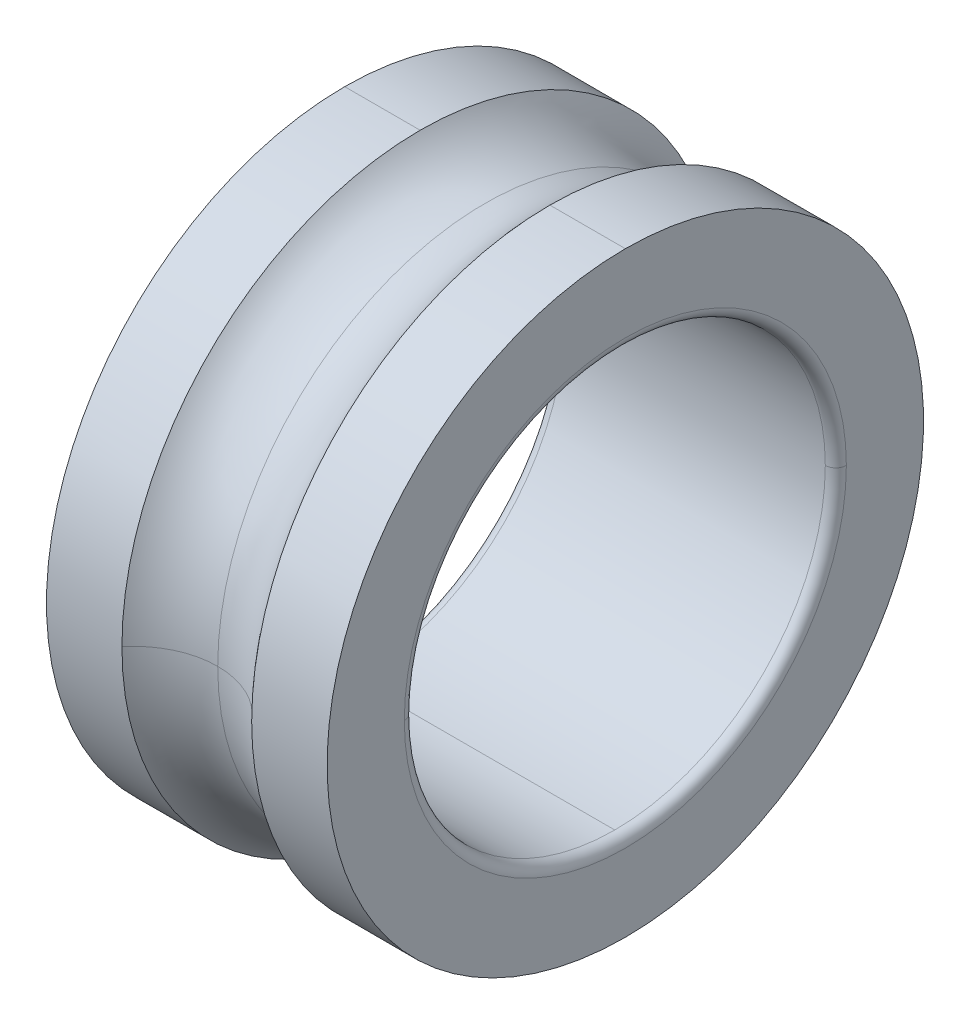
ISO-10303-21;
HEADER;
FILE_DESCRIPTION(('STEP AP214'),'2;1');
FILE_NAME('part.step','',(''),(''),'','','');
FILE_SCHEMA(('AUTOMOTIVE_DESIGN { 1 0 10303 214 1 1 1 1 }'));
ENDSEC;
DATA;
#1=APPLICATION_CONTEXT('core data for automotive mechanical design processes');
#2=APPLICATION_PROTOCOL_DEFINITION('international standard','automotive_design',2000,#1);
#3=PRODUCT_CONTEXT('',#1,'mechanical');
#4=PRODUCT('Part','Part','',(#3));
#5=PRODUCT_RELATED_PRODUCT_CATEGORY('part','',(#4));
#6=PRODUCT_DEFINITION_FORMATION('','',#4);
#7=PRODUCT_DEFINITION_CONTEXT('part definition',#1,'design');
#8=PRODUCT_DEFINITION('design','',#6,#7);
#9=PRODUCT_DEFINITION_SHAPE('','',#8);
#10=(LENGTH_UNIT() NAMED_UNIT(*) SI_UNIT(.MILLI.,.METRE.));
#11=(NAMED_UNIT(*) PLANE_ANGLE_UNIT() SI_UNIT($,.RADIAN.));
#12=(NAMED_UNIT(*) SI_UNIT($,.STERADIAN.) SOLID_ANGLE_UNIT());
#13=UNCERTAINTY_MEASURE_WITH_UNIT(LENGTH_MEASURE(1.E-05),#10,'distance_accuracy_value','');
#14=(GEOMETRIC_REPRESENTATION_CONTEXT(3) GLOBAL_UNCERTAINTY_ASSIGNED_CONTEXT((#13)) GLOBAL_UNIT_ASSIGNED_CONTEXT((#10,
#11,#12)) REPRESENTATION_CONTEXT('',''));
#15=CARTESIAN_POINT('',(0.,0.,0.));
#16=DIRECTION('',(0.,0.,1.));
#17=DIRECTION('',(1.,0.,0.));
#18=AXIS2_PLACEMENT_3D('',#15,#16,#17);
#19=CARTESIAN_POINT('',(6.92454867367814,0.,0.));
#20=DIRECTION('',(1.,0.,0.));
#21=DIRECTION('',(0.,1.,0.));
#22=AXIS2_PLACEMENT_3D('',#19,#20,#21);
#23=CYLINDRICAL_SURFACE('',#22,8.5);
#24=DIRECTION('',(1.,0.,0.));
#25=VECTOR('',#24,1.);
#26=CARTESIAN_POINT('',(6.92454867367814,8.5,0.));
#27=LINE('',#26,#25);
#28=CARTESIAN_POINT('',(5.84909734735627,8.5,0.));
#29=VERTEX_POINT('',#28);
#30=CARTESIAN_POINT('',(8.,8.5,0.));
#31=VERTEX_POINT('',#30);
#32=EDGE_CURVE('E148',#29,#31,#27,.T.);
#33=ORIENTED_EDGE('',*,*,#32,.T.);
#34=CARTESIAN_POINT('',(8.,0.,0.));
#35=DIRECTION('',(1.,0.,0.));
#36=DIRECTION('',(0.,1.,0.));
#37=AXIS2_PLACEMENT_3D('',#34,#35,#36);
#38=CIRCLE('',#37,8.5);
#39=CARTESIAN_POINT('',(8.,-8.5,0.));
#40=VERTEX_POINT('',#39);
#41=EDGE_CURVE('E210',#40,#31,#38,.T.);
#42=ORIENTED_EDGE('',*,*,#41,.F.);
#43=DIRECTION('',(-1.,0.,0.));
#44=VECTOR('',#43,1.);
#45=CARTESIAN_POINT('',(6.92454867367814,-8.5,0.));
#46=LINE('',#45,#44);
#47=CARTESIAN_POINT('',(5.84909734735627,-8.5,0.));
#48=VERTEX_POINT('',#47);
#49=EDGE_CURVE('E154',#40,#48,#46,.T.);
#50=ORIENTED_EDGE('',*,*,#49,.T.);
#51=CARTESIAN_POINT('',(5.84909734735627,0.,0.));
#52=DIRECTION('',(1.,0.,0.));
#53=DIRECTION('',(0.,1.,0.));
#54=AXIS2_PLACEMENT_3D('',#51,#52,#53);
#55=CIRCLE('',#54,8.5);
#56=CARTESIAN_POINT('',(5.84909734735627,0.,-8.5));
#57=VERTEX_POINT('',#56);
#58=EDGE_CURVE('E139',#48,#57,#55,.T.);
#59=ORIENTED_EDGE('',*,*,#58,.T.);
#60=CARTESIAN_POINT('',(5.84909734735627,0.,0.));
#61=DIRECTION('',(1.,0.,0.));
#62=DIRECTION('',(0.,1.,0.));
#63=AXIS2_PLACEMENT_3D('',#60,#61,#62);
#64=CIRCLE('',#63,8.5);
#65=EDGE_CURVE('E145',#57,#29,#64,.T.);
#66=ORIENTED_EDGE('',*,*,#65,.T.);
#67=EDGE_LOOP('',(#33,#42,#50,#59,#66));
#68=FACE_BOUND('',#67,.T.);
#69=ADVANCED_FACE('F16',(#68),#23,.T.);
#70=CARTESIAN_POINT('',(4.,0.,0.));
#71=DIRECTION('',(1.,0.,0.));
#72=DIRECTION('',(0.,0.,-1.));
#73=AXIS2_PLACEMENT_3D('',#70,#71,#72);
#74=TOROIDAL_SURFACE('',#73,10.,2.381);
#75=CARTESIAN_POINT('',(4.,0.,0.));
#76=DIRECTION('',(-1.,0.,0.));
#77=DIRECTION('',(0.,0.,1.));
#78=AXIS2_PLACEMENT_3D('',#75,#76,#77);
#79=CIRCLE('',#78,7.619);
#80=CARTESIAN_POINT('',(4.,0.,7.619));
#81=VERTEX_POINT('',#80);
#82=CARTESIAN_POINT('',(4.,0.,-7.619));
#83=VERTEX_POINT('',#82);
#84=EDGE_CURVE('E132',#81,#83,#79,.T.);
#85=ORIENTED_EDGE('',*,*,#84,.T.);
#86=CARTESIAN_POINT('',(4.,0.,-10.));
#87=DIRECTION('',(0.,-1.,0.));
#88=DIRECTION('',(0.,0.,-1.));
#89=AXIS2_PLACEMENT_3D('',#86,#87,#88);
#90=CIRCLE('',#89,2.381);
#91=CARTESIAN_POINT('',(2.15090265264373,0.,-8.5));
#92=VERTEX_POINT('',#91);
#93=EDGE_CURVE('E126',#83,#92,#90,.T.);
#94=ORIENTED_EDGE('',*,*,#93,.T.);
#95=CARTESIAN_POINT('',(2.15090265264373,0.,0.));
#96=DIRECTION('',(1.,0.,0.));
#97=DIRECTION('',(0.,1.,0.));
#98=AXIS2_PLACEMENT_3D('',#95,#96,#97);
#99=CIRCLE('',#98,8.5);
#100=CARTESIAN_POINT('',(2.15090265264373,8.5,0.));
#101=VERTEX_POINT('',#100);
#102=EDGE_CURVE('E11',#92,#101,#99,.T.);
#103=ORIENTED_EDGE('',*,*,#102,.T.);
#104=CARTESIAN_POINT('',(2.15090265264373,0.,0.));
#105=DIRECTION('',(1.,0.,0.));
#106=DIRECTION('',(0.,1.,0.));
#107=AXIS2_PLACEMENT_3D('',#104,#105,#106);
#108=CIRCLE('',#107,8.5);
#109=CARTESIAN_POINT('',(2.15090265264373,0.,8.5));
#110=VERTEX_POINT('',#109);
#111=EDGE_CURVE('E125',#101,#110,#108,.T.);
#112=ORIENTED_EDGE('',*,*,#111,.T.);
#113=CARTESIAN_POINT('',(4.,0.,10.));
#114=DIRECTION('',(0.,-1.,0.));
#115=DIRECTION('',(0.,0.,1.));
#116=AXIS2_PLACEMENT_3D('',#113,#114,#115);
#117=CIRCLE('',#116,2.381);
#118=EDGE_CURVE('E163',#110,#81,#117,.T.);
#119=ORIENTED_EDGE('',*,*,#118,.T.);
#120=EDGE_LOOP('',(#85,#94,#103,#112,#119));
#121=FACE_BOUND('',#120,.T.);
#122=ADVANCED_FACE('F259',(#121),#74,.F.);
#123=CARTESIAN_POINT('',(1.07545132632186,0.,0.));
#124=DIRECTION('',(1.,0.,0.));
#125=DIRECTION('',(0.,1.,0.));
#126=AXIS2_PLACEMENT_3D('',#123,#124,#125);
#127=CYLINDRICAL_SURFACE('',#126,8.5);
#128=DIRECTION('',(1.,0.,0.));
#129=VECTOR('',#128,1.);
#130=CARTESIAN_POINT('',(1.07545132632186,8.5,0.));
#131=LINE('',#130,#129);
#132=CARTESIAN_POINT('',(0.,8.5,0.));
#133=VERTEX_POINT('',#132);
#134=EDGE_CURVE('E112',#133,#101,#131,.T.);
#135=ORIENTED_EDGE('',*,*,#134,.T.);
#136=ORIENTED_EDGE('',*,*,#102,.F.);
#137=CARTESIAN_POINT('',(2.15090265264373,0.,0.));
#138=DIRECTION('',(1.,0.,0.));
#139=DIRECTION('',(0.,1.,0.));
#140=AXIS2_PLACEMENT_3D('',#137,#138,#139);
#141=CIRCLE('',#140,8.5);
#142=CARTESIAN_POINT('',(2.15090265264373,-8.5,0.));
#143=VERTEX_POINT('',#142);
#144=EDGE_CURVE('E129',#143,#92,#141,.T.);
#145=ORIENTED_EDGE('',*,*,#144,.F.);
#146=DIRECTION('',(-1.,0.,0.));
#147=VECTOR('',#146,1.);
#148=CARTESIAN_POINT('',(1.07545132632186,-8.5,0.));
#149=LINE('',#148,#147);
#150=CARTESIAN_POINT('',(0.,-8.5,0.));
#151=VERTEX_POINT('',#150);
#152=EDGE_CURVE('E114',#143,#151,#149,.T.);
#153=ORIENTED_EDGE('',*,*,#152,.T.);
#154=CARTESIAN_POINT('',(0.,0.,0.));
#155=DIRECTION('',(1.,0.,0.));
#156=DIRECTION('',(0.,1.,0.));
#157=AXIS2_PLACEMENT_3D('',#154,#155,#156);
#158=CIRCLE('',#157,8.5);
#159=EDGE_CURVE('E23',#151,#133,#158,.T.);
#160=ORIENTED_EDGE('',*,*,#159,.T.);
#161=EDGE_LOOP('',(#135,#136,#145,#153,#160));
#162=FACE_BOUND('',#161,.T.);
#163=ADVANCED_FACE('F110',(#162),#127,.T.);
#164=CARTESIAN_POINT('',(0.,7.4,0.));
#165=DIRECTION('',(-1.,0.,0.));
#166=DIRECTION('',(0.,0.,1.));
#167=AXIS2_PLACEMENT_3D('',#164,#165,#166);
#168=PLANE('',#167);
#169=CARTESIAN_POINT('',(0.,0.,0.));
#170=DIRECTION('',(1.,0.,0.));
#171=DIRECTION('',(0.,1.,0.));
#172=AXIS2_PLACEMENT_3D('',#169,#170,#171);
#173=CIRCLE('',#172,6.3);
#174=CARTESIAN_POINT('',(0.,0.,6.3));
#175=VERTEX_POINT('',#174);
#176=CARTESIAN_POINT('',(0.,0.,-6.3));
#177=VERTEX_POINT('',#176);
#178=EDGE_CURVE('E117',#175,#177,#173,.T.);
#179=ORIENTED_EDGE('',*,*,#178,.T.);
#180=CARTESIAN_POINT('',(0.,0.,0.));
#181=DIRECTION('',(1.,0.,0.));
#182=DIRECTION('',(0.,1.,0.));
#183=AXIS2_PLACEMENT_3D('',#180,#181,#182);
#184=CIRCLE('',#183,6.3);
#185=EDGE_CURVE('E184',#177,#175,#184,.T.);
#186=ORIENTED_EDGE('',*,*,#185,.T.);
#187=EDGE_LOOP('',(#179,#186));
#188=FACE_BOUND('',#187,.T.);
#189=CARTESIAN_POINT('',(0.,0.,0.));
#190=DIRECTION('',(1.,0.,0.));
#191=DIRECTION('',(0.,1.,0.));
#192=AXIS2_PLACEMENT_3D('',#189,#190,#191);
#193=CIRCLE('',#192,8.5);
#194=EDGE_CURVE('E118',#133,#151,#193,.T.);
#195=ORIENTED_EDGE('',*,*,#194,.F.);
#196=ORIENTED_EDGE('',*,*,#159,.F.);
#197=EDGE_LOOP('',(#195,#196));
#198=FACE_BOUND('',#197,.T.);
#199=ADVANCED_FACE('F119',(#188,#198),#168,.T.);
#200=CARTESIAN_POINT('',(0.3,0.,0.));
#201=DIRECTION('',(1.,0.,0.));
#202=DIRECTION('',(0.,0.,-1.));
#203=AXIS2_PLACEMENT_3D('',#200,#201,#202);
#204=TOROIDAL_SURFACE('',#203,6.3,0.3);
#205=CARTESIAN_POINT('',(0.3,0.,-6.3));
#206=DIRECTION('',(0.,-1.,0.));
#207=DIRECTION('',(0.,0.,-1.));
#208=AXIS2_PLACEMENT_3D('',#205,#206,#207);
#209=CIRCLE('',#208,0.3);
#210=CARTESIAN_POINT('',(0.3,0.,-6.));
#211=VERTEX_POINT('',#210);
#212=EDGE_CURVE('E172',#211,#177,#209,.T.);
#213=ORIENTED_EDGE('',*,*,#212,.T.);
#214=ORIENTED_EDGE('',*,*,#178,.F.);
#215=CARTESIAN_POINT('',(0.3,0.,6.3));
#216=DIRECTION('',(0.,-1.,0.));
#217=DIRECTION('',(0.,0.,1.));
#218=AXIS2_PLACEMENT_3D('',#215,#216,#217);
#219=CIRCLE('',#218,0.3);
#220=CARTESIAN_POINT('',(0.3,0.,6.));
#221=VERTEX_POINT('',#220);
#222=EDGE_CURVE('E181',#175,#221,#219,.T.);
#223=ORIENTED_EDGE('',*,*,#222,.T.);
#224=CARTESIAN_POINT('',(0.3,0.,0.));
#225=DIRECTION('',(1.,0.,0.));
#226=DIRECTION('',(0.,1.,0.));
#227=AXIS2_PLACEMENT_3D('',#224,#225,#226);
#228=CIRCLE('',#227,6.);
#229=CARTESIAN_POINT('',(0.3,-6.,0.));
#230=VERTEX_POINT('',#229);
#231=EDGE_CURVE('E214',#221,#230,#228,.T.);
#232=ORIENTED_EDGE('',*,*,#231,.T.);
#233=CARTESIAN_POINT('',(0.3,0.,0.));
#234=DIRECTION('',(1.,0.,0.));
#235=DIRECTION('',(0.,1.,0.));
#236=AXIS2_PLACEMENT_3D('',#233,#234,#235);
#237=CIRCLE('',#236,6.);
#238=EDGE_CURVE('E190',#230,#211,#237,.T.);
#239=ORIENTED_EDGE('',*,*,#238,.T.);
#240=EDGE_LOOP('',(#213,#214,#223,#232,#239));
#241=FACE_BOUND('',#240,.T.);
#242=ADVANCED_FACE('F223',(#241),#204,.T.);
#243=CARTESIAN_POINT('',(4.,0.,0.));
#244=DIRECTION('',(1.,0.,0.));
#245=DIRECTION('',(0.,1.,0.));
#246=AXIS2_PLACEMENT_3D('',#243,#244,#245);
#247=CYLINDRICAL_SURFACE('',#246,6.);
#248=DIRECTION('',(1.,0.,0.));
#249=VECTOR('',#248,1.);
#250=CARTESIAN_POINT('',(4.,6.,0.));
#251=LINE('',#250,#249);
#252=CARTESIAN_POINT('',(0.3,6.,0.));
#253=VERTEX_POINT('',#252);
#254=CARTESIAN_POINT('',(7.7,6.,0.));
#255=VERTEX_POINT('',#254);
#256=EDGE_CURVE('E187',#253,#255,#251,.T.);
#257=ORIENTED_EDGE('',*,*,#256,.T.);
#258=CARTESIAN_POINT('',(7.7,0.,0.));
#259=DIRECTION('',(1.,0.,0.));
#260=DIRECTION('',(0.,1.,0.));
#261=AXIS2_PLACEMENT_3D('',#258,#259,#260);
#262=CIRCLE('',#261,6.);
#263=CARTESIAN_POINT('',(7.7,0.,6.));
#264=VERTEX_POINT('',#263);
#265=EDGE_CURVE('E208',#255,#264,#262,.T.);
#266=ORIENTED_EDGE('',*,*,#265,.T.);
#267=CARTESIAN_POINT('',(7.7,0.,0.));
#268=DIRECTION('',(1.,0.,0.));
#269=DIRECTION('',(0.,1.,0.));
#270=AXIS2_PLACEMENT_3D('',#267,#268,#269);
#271=CIRCLE('',#270,6.);
#272=CARTESIAN_POINT('',(7.7,-6.,0.));
#273=VERTEX_POINT('',#272);
#274=EDGE_CURVE('E30',#264,#273,#271,.T.);
#275=ORIENTED_EDGE('',*,*,#274,.T.);
#276=DIRECTION('',(-1.,0.,0.));
#277=VECTOR('',#276,1.);
#278=CARTESIAN_POINT('',(4.,-6.,0.));
#279=LINE('',#278,#277);
#280=EDGE_CURVE('E192',#273,#230,#279,.T.);
#281=ORIENTED_EDGE('',*,*,#280,.T.);
#282=ORIENTED_EDGE('',*,*,#231,.F.);
#283=CARTESIAN_POINT('',(0.3,0.,0.));
#284=DIRECTION('',(1.,0.,0.));
#285=DIRECTION('',(0.,1.,0.));
#286=AXIS2_PLACEMENT_3D('',#283,#284,#285);
#287=CIRCLE('',#286,6.);
#288=EDGE_CURVE('E178',#253,#221,#287,.T.);
#289=ORIENTED_EDGE('',*,*,#288,.F.);
#290=EDGE_LOOP('',(#257,#266,#275,#281,#282,#289));
#291=FACE_BOUND('',#290,.T.);
#292=ADVANCED_FACE('F231',(#291),#247,.F.);
#293=CARTESIAN_POINT('',(7.7,0.,0.));
#294=DIRECTION('',(1.,0.,0.));
#295=DIRECTION('',(0.,0.,-1.));
#296=AXIS2_PLACEMENT_3D('',#293,#294,#295);
#297=TOROIDAL_SURFACE('',#296,6.3,0.3);
#298=CARTESIAN_POINT('',(7.7,0.,-6.3));
#299=DIRECTION('',(0.,-1.,0.));
#300=DIRECTION('',(0.,0.,-1.));
#301=AXIS2_PLACEMENT_3D('',#298,#299,#300);
#302=CIRCLE('',#301,0.3);
#303=CARTESIAN_POINT('',(8.,0.,-6.3));
#304=VERTEX_POINT('',#303);
#305=CARTESIAN_POINT('',(7.7,0.,-6.));
#306=VERTEX_POINT('',#305);
#307=EDGE_CURVE('E201',#304,#306,#302,.T.);
#308=ORIENTED_EDGE('',*,*,#307,.T.);
#309=CARTESIAN_POINT('',(7.7,0.,0.));
#310=DIRECTION('',(1.,0.,0.));
#311=DIRECTION('',(0.,1.,0.));
#312=AXIS2_PLACEMENT_3D('',#309,#310,#311);
#313=CIRCLE('',#312,6.);
#314=EDGE_CURVE('E195',#273,#306,#313,.T.);
#315=ORIENTED_EDGE('',*,*,#314,.F.);
#316=ORIENTED_EDGE('',*,*,#274,.F.);
#317=CARTESIAN_POINT('',(7.7,0.,6.3));
#318=DIRECTION('',(0.,-1.,0.));
#319=DIRECTION('',(0.,0.,1.));
#320=AXIS2_PLACEMENT_3D('',#317,#318,#319);
#321=CIRCLE('',#320,0.3);
#322=CARTESIAN_POINT('',(8.,0.,6.3));
#323=VERTEX_POINT('',#322);
#324=EDGE_CURVE('E206',#264,#323,#321,.T.);
#325=ORIENTED_EDGE('',*,*,#324,.T.);
#326=CARTESIAN_POINT('',(8.,0.,0.));
#327=DIRECTION('',(1.,0.,0.));
#328=DIRECTION('',(0.,1.,0.));
#329=AXIS2_PLACEMENT_3D('',#326,#327,#328);
#330=CIRCLE('',#329,6.3);
#331=EDGE_CURVE('E37',#323,#304,#330,.T.);
#332=ORIENTED_EDGE('',*,*,#331,.T.);
#333=EDGE_LOOP('',(#308,#315,#316,#325,#332));
#334=FACE_BOUND('',#333,.T.);
#335=ADVANCED_FACE('F233',(#334),#297,.T.);
#336=CARTESIAN_POINT('',(8.,7.4,0.));
#337=DIRECTION('',(1.,0.,0.));
#338=DIRECTION('',(0.,1.,0.));
#339=AXIS2_PLACEMENT_3D('',#336,#337,#338);
#340=PLANE('',#339);
#341=CARTESIAN_POINT('',(8.,0.,0.));
#342=DIRECTION('',(1.,0.,0.));
#343=DIRECTION('',(0.,1.,0.));
#344=AXIS2_PLACEMENT_3D('',#341,#342,#343);
#345=CIRCLE('',#344,6.3);
#346=EDGE_CURVE('E203',#304,#323,#345,.T.);
#347=ORIENTED_EDGE('',*,*,#346,.F.);
#348=ORIENTED_EDGE('',*,*,#331,.F.);
#349=EDGE_LOOP('',(#347,#348));
#350=FACE_BOUND('',#349,.T.);
#351=CARTESIAN_POINT('',(8.,0.,0.));
#352=DIRECTION('',(1.,0.,0.));
#353=DIRECTION('',(0.,1.,0.));
#354=AXIS2_PLACEMENT_3D('',#351,#352,#353);
#355=CIRCLE('',#354,8.5);
#356=EDGE_CURVE('E156',#31,#40,#355,.T.);
#357=ORIENTED_EDGE('',*,*,#356,.T.);
#358=ORIENTED_EDGE('',*,*,#41,.T.);
#359=EDGE_LOOP('',(#357,#358));
#360=FACE_BOUND('',#359,.T.);
#361=ADVANCED_FACE('F238',(#350,#360),#340,.T.);
#362=CARTESIAN_POINT('',(7.7,0.,0.));
#363=DIRECTION('',(1.,0.,0.));
#364=DIRECTION('',(0.,0.,-1.));
#365=AXIS2_PLACEMENT_3D('',#362,#363,#364);
#366=TOROIDAL_SURFACE('',#365,6.3,0.3);
#367=ORIENTED_EDGE('',*,*,#307,.F.);
#368=ORIENTED_EDGE('',*,*,#346,.T.);
#369=ORIENTED_EDGE('',*,*,#324,.F.);
#370=ORIENTED_EDGE('',*,*,#265,.F.);
#371=CARTESIAN_POINT('',(7.7,0.,0.));
#372=DIRECTION('',(1.,0.,0.));
#373=DIRECTION('',(0.,1.,0.));
#374=AXIS2_PLACEMENT_3D('',#371,#372,#373);
#375=CIRCLE('',#374,6.);
#376=EDGE_CURVE('E198',#306,#255,#375,.T.);
#377=ORIENTED_EDGE('',*,*,#376,.F.);
#378=EDGE_LOOP('',(#367,#368,#369,#370,#377));
#379=FACE_BOUND('',#378,.T.);
#380=ADVANCED_FACE('F236',(#379),#366,.T.);
#381=CARTESIAN_POINT('',(4.,0.,0.));
#382=DIRECTION('',(1.,0.,0.));
#383=DIRECTION('',(0.,1.,0.));
#384=AXIS2_PLACEMENT_3D('',#381,#382,#383);
#385=CYLINDRICAL_SURFACE('',#384,6.);
#386=ORIENTED_EDGE('',*,*,#256,.F.);
#387=CARTESIAN_POINT('',(0.3,0.,0.));
#388=DIRECTION('',(1.,0.,0.));
#389=DIRECTION('',(0.,1.,0.));
#390=AXIS2_PLACEMENT_3D('',#387,#388,#389);
#391=CIRCLE('',#390,6.);
#392=EDGE_CURVE('E175',#211,#253,#391,.T.);
#393=ORIENTED_EDGE('',*,*,#392,.F.);
#394=ORIENTED_EDGE('',*,*,#238,.F.);
#395=ORIENTED_EDGE('',*,*,#280,.F.);
#396=ORIENTED_EDGE('',*,*,#314,.T.);
#397=ORIENTED_EDGE('',*,*,#376,.T.);
#398=EDGE_LOOP('',(#386,#393,#394,#395,#396,#397));
#399=FACE_BOUND('',#398,.T.);
#400=ADVANCED_FACE('F228',(#399),#385,.F.);
#401=CARTESIAN_POINT('',(0.3,0.,0.));
#402=DIRECTION('',(1.,0.,0.));
#403=DIRECTION('',(0.,0.,-1.));
#404=AXIS2_PLACEMENT_3D('',#401,#402,#403);
#405=TOROIDAL_SURFACE('',#404,6.3,0.3);
#406=ORIENTED_EDGE('',*,*,#212,.F.);
#407=ORIENTED_EDGE('',*,*,#392,.T.);
#408=ORIENTED_EDGE('',*,*,#288,.T.);
#409=ORIENTED_EDGE('',*,*,#222,.F.);
#410=ORIENTED_EDGE('',*,*,#185,.F.);
#411=EDGE_LOOP('',(#406,#407,#408,#409,#410));
#412=FACE_BOUND('',#411,.T.);
#413=ADVANCED_FACE('F222',(#412),#405,.T.);
#414=CARTESIAN_POINT('',(1.07545132632186,0.,0.));
#415=DIRECTION('',(1.,0.,0.));
#416=DIRECTION('',(0.,1.,0.));
#417=AXIS2_PLACEMENT_3D('',#414,#415,#416);
#418=CYLINDRICAL_SURFACE('',#417,8.5);
#419=ORIENTED_EDGE('',*,*,#134,.F.);
#420=ORIENTED_EDGE('',*,*,#194,.T.);
#421=ORIENTED_EDGE('',*,*,#152,.F.);
#422=CARTESIAN_POINT('',(2.15090265264373,0.,0.));
#423=DIRECTION('',(1.,0.,0.));
#424=DIRECTION('',(0.,1.,0.));
#425=AXIS2_PLACEMENT_3D('',#422,#423,#424);
#426=CIRCLE('',#425,8.5);
#427=EDGE_CURVE('E165',#110,#143,#426,.T.);
#428=ORIENTED_EDGE('',*,*,#427,.F.);
#429=ORIENTED_EDGE('',*,*,#111,.F.);
#430=EDGE_LOOP('',(#419,#420,#421,#428,#429));
#431=FACE_BOUND('',#430,.T.);
#432=ADVANCED_FACE('F123',(#431),#418,.T.);
#433=CARTESIAN_POINT('',(4.,0.,0.));
#434=DIRECTION('',(1.,0.,0.));
#435=DIRECTION('',(0.,0.,-1.));
#436=AXIS2_PLACEMENT_3D('',#433,#434,#435);
#437=TOROIDAL_SURFACE('',#436,10.,2.381);
#438=CARTESIAN_POINT('',(4.,0.,0.));
#439=DIRECTION('',(-1.,0.,0.));
#440=DIRECTION('',(0.,0.,1.));
#441=AXIS2_PLACEMENT_3D('',#438,#439,#440);
#442=CIRCLE('',#441,7.619);
#443=EDGE_CURVE('E142',#83,#81,#442,.T.);
#444=ORIENTED_EDGE('',*,*,#443,.T.);
#445=ORIENTED_EDGE('',*,*,#118,.F.);
#446=ORIENTED_EDGE('',*,*,#427,.T.);
#447=ORIENTED_EDGE('',*,*,#144,.T.);
#448=ORIENTED_EDGE('',*,*,#93,.F.);
#449=EDGE_LOOP('',(#444,#445,#446,#447,#448));
#450=FACE_BOUND('',#449,.T.);
#451=ADVANCED_FACE('F262',(#450),#437,.F.);
#452=CARTESIAN_POINT('',(6.92454867367814,0.,0.));
#453=DIRECTION('',(1.,0.,0.));
#454=DIRECTION('',(0.,1.,0.));
#455=AXIS2_PLACEMENT_3D('',#452,#453,#454);
#456=CYLINDRICAL_SURFACE('',#455,8.5);
#457=ORIENTED_EDGE('',*,*,#32,.F.);
#458=CARTESIAN_POINT('',(5.84909734735627,0.,0.));
#459=DIRECTION('',(1.,0.,0.));
#460=DIRECTION('',(0.,1.,0.));
#461=AXIS2_PLACEMENT_3D('',#458,#459,#460);
#462=CIRCLE('',#461,8.5);
#463=CARTESIAN_POINT('',(5.84909734735627,0.,8.5));
#464=VERTEX_POINT('',#463);
#465=EDGE_CURVE('E138',#29,#464,#462,.T.);
#466=ORIENTED_EDGE('',*,*,#465,.T.);
#467=CARTESIAN_POINT('',(5.84909734735627,0.,0.));
#468=DIRECTION('',(1.,0.,0.));
#469=DIRECTION('',(0.,1.,0.));
#470=AXIS2_PLACEMENT_3D('',#467,#468,#469);
#471=CIRCLE('',#470,8.5);
#472=EDGE_CURVE('E141',#464,#48,#471,.T.);
#473=ORIENTED_EDGE('',*,*,#472,.T.);
#474=ORIENTED_EDGE('',*,*,#49,.F.);
#475=ORIENTED_EDGE('',*,*,#356,.F.);
#476=EDGE_LOOP('',(#457,#466,#473,#474,#475));
#477=FACE_BOUND('',#476,.T.);
#478=ADVANCED_FACE('F245',(#477),#456,.T.);
#479=CARTESIAN_POINT('',(4.,0.,0.));
#480=DIRECTION('',(1.,0.,0.));
#481=DIRECTION('',(0.,0.,-1.));
#482=AXIS2_PLACEMENT_3D('',#479,#480,#481);
#483=TOROIDAL_SURFACE('',#482,10.,2.381);
#484=ORIENTED_EDGE('',*,*,#443,.F.);
#485=CARTESIAN_POINT('',(4.,0.,-10.));
#486=DIRECTION('',(0.,-1.,0.));
#487=DIRECTION('',(0.,0.,-1.));
#488=AXIS2_PLACEMENT_3D('',#485,#486,#487);
#489=CIRCLE('',#488,2.381);
#490=EDGE_CURVE('E151',#57,#83,#489,.T.);
#491=ORIENTED_EDGE('',*,*,#490,.F.);
#492=ORIENTED_EDGE('',*,*,#58,.F.);
#493=ORIENTED_EDGE('',*,*,#472,.F.);
#494=CARTESIAN_POINT('',(4.,0.,10.));
#495=DIRECTION('',(0.,-1.,0.));
#496=DIRECTION('',(0.,0.,1.));
#497=AXIS2_PLACEMENT_3D('',#494,#495,#496);
#498=CIRCLE('',#497,2.381);
#499=EDGE_CURVE('E135',#81,#464,#498,.T.);
#500=ORIENTED_EDGE('',*,*,#499,.F.);
#501=EDGE_LOOP('',(#484,#491,#492,#493,#500));
#502=FACE_BOUND('',#501,.T.);
#503=ADVANCED_FACE('F257',(#502),#483,.F.);
#504=CARTESIAN_POINT('',(4.,0.,0.));
#505=DIRECTION('',(1.,0.,0.));
#506=DIRECTION('',(0.,0.,-1.));
#507=AXIS2_PLACEMENT_3D('',#504,#505,#506);
#508=TOROIDAL_SURFACE('',#507,10.,2.381);
#509=ORIENTED_EDGE('',*,*,#84,.F.);
#510=ORIENTED_EDGE('',*,*,#499,.T.);
#511=ORIENTED_EDGE('',*,*,#465,.F.);
#512=ORIENTED_EDGE('',*,*,#65,.F.);
#513=ORIENTED_EDGE('',*,*,#490,.T.);
#514=EDGE_LOOP('',(#509,#510,#511,#512,#513));
#515=FACE_BOUND('',#514,.T.);
#516=ADVANCED_FACE('F254',(#515),#508,.F.);
#517=CLOSED_SHELL('',(#69,#122,#163,#199,#242,#292,#335,#361,#380,#400,#413,#432,#451,#478,#503,#516));
#518=MANIFOLD_SOLID_BREP('B1',#517);
#519=ADVANCED_BREP_SHAPE_REPRESENTATION('',(#18,#518),#14);
#520=SHAPE_DEFINITION_REPRESENTATION(#9,#519);
ENDSEC;
END-ISO-10303-21;
